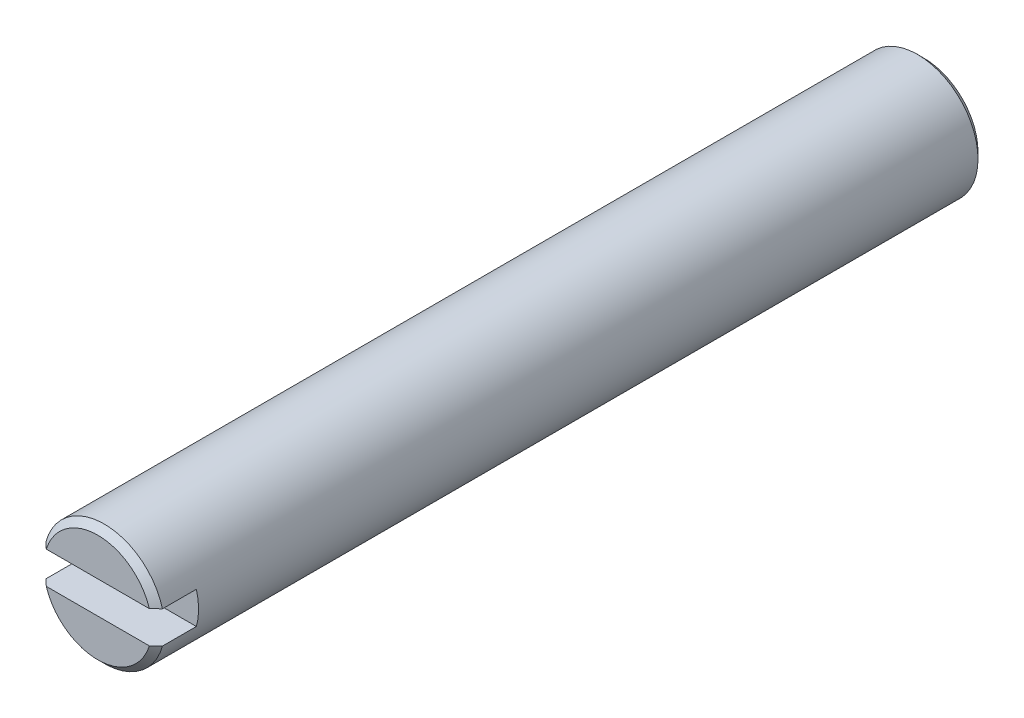
ISO-10303-21;
HEADER;
FILE_DESCRIPTION(('STEP AP214'),'2;1');
FILE_NAME('part.step','',(''),(''),'','','');
FILE_SCHEMA(('AUTOMOTIVE_DESIGN { 1 0 10303 214 1 1 1 1 }'));
ENDSEC;
DATA;
#1=APPLICATION_CONTEXT('core data for automotive mechanical design processes');
#2=APPLICATION_PROTOCOL_DEFINITION('international standard','automotive_design',2000,#1);
#3=PRODUCT_CONTEXT('',#1,'mechanical');
#4=PRODUCT('Part','Part','',(#3));
#5=PRODUCT_RELATED_PRODUCT_CATEGORY('part','',(#4));
#6=PRODUCT_DEFINITION_FORMATION('','',#4);
#7=PRODUCT_DEFINITION_CONTEXT('part definition',#1,'design');
#8=PRODUCT_DEFINITION('design','',#6,#7);
#9=PRODUCT_DEFINITION_SHAPE('','',#8);
#10=(LENGTH_UNIT() NAMED_UNIT(*) SI_UNIT(.MILLI.,.METRE.));
#11=(NAMED_UNIT(*) PLANE_ANGLE_UNIT() SI_UNIT($,.RADIAN.));
#12=(NAMED_UNIT(*) SI_UNIT($,.STERADIAN.) SOLID_ANGLE_UNIT());
#13=UNCERTAINTY_MEASURE_WITH_UNIT(LENGTH_MEASURE(1.E-05),#10,'distance_accuracy_value','');
#14=(GEOMETRIC_REPRESENTATION_CONTEXT(3) GLOBAL_UNCERTAINTY_ASSIGNED_CONTEXT((#13)) GLOBAL_UNIT_ASSIGNED_CONTEXT((#10,
#11,#12)) REPRESENTATION_CONTEXT('',''));
#15=CARTESIAN_POINT('',(0.,0.,0.));
#16=DIRECTION('',(0.,0.,1.));
#17=DIRECTION('',(1.,0.,0.));
#18=AXIS2_PLACEMENT_3D('',#15,#16,#17);
#19=CARTESIAN_POINT('',(0.,0.,2.563));
#20=DIRECTION('',(0.,0.,-1.));
#21=DIRECTION('',(-1.,0.,0.));
#22=AXIS2_PLACEMENT_3D('',#19,#20,#21);
#23=CYLINDRICAL_SURFACE('',#22,0.1875);
#24=CARTESIAN_POINT('',(0.,0.,0.0200000000000005));
#25=DIRECTION('',(0.,0.,1.));
#26=DIRECTION('',(1.,0.,0.));
#27=AXIS2_PLACEMENT_3D('',#24,#25,#26);
#28=CIRCLE('',#27,0.1875);
#29=CARTESIAN_POINT('',(0.1875,0.,0.0200000000000005));
#30=VERTEX_POINT('',#29);
#31=EDGE_CURVE('E52',#30,#30,#28,.T.);
#32=ORIENTED_EDGE('',*,*,#31,.T.);
#33=EDGE_LOOP('',(#32));
#34=FACE_BOUND('',#33,.T.);
#35=DIRECTION('',(0.,0.,1.));
#36=VECTOR('',#35,1.);
#37=CARTESIAN_POINT('',(0.180710403685012,-0.05,2.438));
#38=LINE('',#37,#36);
#39=CARTESIAN_POINT('',(0.180710403685012,-0.05,2.438));
#40=VERTEX_POINT('',#39);
#41=CARTESIAN_POINT('',(0.180710403685012,-0.05,2.543));
#42=VERTEX_POINT('',#41);
#43=EDGE_CURVE('E129',#40,#42,#38,.T.);
#44=ORIENTED_EDGE('',*,*,#43,.T.);
#45=CARTESIAN_POINT('',(0.,0.,2.543));
#46=DIRECTION('',(0.,0.,1.));
#47=DIRECTION('',(1.,0.,0.));
#48=AXIS2_PLACEMENT_3D('',#45,#46,#47);
#49=CIRCLE('',#48,0.1875);
#50=CARTESIAN_POINT('',(-0.180710403685012,-0.05,2.543));
#51=VERTEX_POINT('',#50);
#52=EDGE_CURVE('E59',#42,#51,#49,.F.);
#53=ORIENTED_EDGE('',*,*,#52,.T.);
#54=DIRECTION('',(0.,0.,1.));
#55=VECTOR('',#54,1.);
#56=CARTESIAN_POINT('',(-0.180710403685012,-0.05,2.438));
#57=LINE('',#56,#55);
#58=CARTESIAN_POINT('',(-0.180710403685012,-0.05,2.438));
#59=VERTEX_POINT('',#58);
#60=EDGE_CURVE('E108',#59,#51,#57,.T.);
#61=ORIENTED_EDGE('',*,*,#60,.F.);
#62=CARTESIAN_POINT('',(0.,0.,2.438));
#63=DIRECTION('',(0.,0.,1.));
#64=DIRECTION('',(1.,0.,0.));
#65=AXIS2_PLACEMENT_3D('',#62,#63,#64);
#66=CIRCLE('',#65,0.1875);
#67=CARTESIAN_POINT('',(-0.180710403685012,0.05,2.438));
#68=VERTEX_POINT('',#67);
#69=EDGE_CURVE('E115',#68,#59,#66,.T.);
#70=ORIENTED_EDGE('',*,*,#69,.F.);
#71=DIRECTION('',(0.,0.,1.));
#72=VECTOR('',#71,1.);
#73=CARTESIAN_POINT('',(-0.180710403685012,0.05,2.438));
#74=LINE('',#73,#72);
#75=CARTESIAN_POINT('',(-0.180710403685012,0.05,2.543));
#76=VERTEX_POINT('',#75);
#77=EDGE_CURVE('E97',#68,#76,#74,.T.);
#78=ORIENTED_EDGE('',*,*,#77,.T.);
#79=CARTESIAN_POINT('',(0.,0.,2.543));
#80=DIRECTION('',(0.,0.,1.));
#81=DIRECTION('',(1.,0.,0.));
#82=AXIS2_PLACEMENT_3D('',#79,#80,#81);
#83=CIRCLE('',#82,0.1875);
#84=CARTESIAN_POINT('',(0.180710403685012,0.05,2.543));
#85=VERTEX_POINT('',#84);
#86=EDGE_CURVE('E144',#76,#85,#83,.F.);
#87=ORIENTED_EDGE('',*,*,#86,.T.);
#88=DIRECTION('',(0.,0.,1.));
#89=VECTOR('',#88,1.);
#90=CARTESIAN_POINT('',(0.180710403685012,0.05,2.438));
#91=LINE('',#90,#89);
#92=CARTESIAN_POINT('',(0.180710403685012,0.05,2.438));
#93=VERTEX_POINT('',#92);
#94=EDGE_CURVE('E132',#93,#85,#91,.T.);
#95=ORIENTED_EDGE('',*,*,#94,.F.);
#96=EDGE_CURVE('E109',#40,#93,#66,.T.);
#97=ORIENTED_EDGE('',*,*,#96,.F.);
#98=EDGE_LOOP('',(#44,#53,#61,#70,#78,#87,#95,#97));
#99=FACE_BOUND('',#98,.T.);
#100=ADVANCED_FACE('F42',(#34,#99),#23,.T.);
#101=CARTESIAN_POINT('',(0.,0.,2.563));
#102=DIRECTION('',(0.,0.,1.));
#103=DIRECTION('',(1.,0.,0.));
#104=AXIS2_PLACEMENT_3D('',#101,#102,#103);
#105=PLANE('',#104);
#106=DIRECTION('',(1.,0.,0.));
#107=VECTOR('',#106,1.);
#108=CARTESIAN_POINT('',(0.,0.05,2.563));
#109=LINE('',#108,#107);
#110=CARTESIAN_POINT('',(-0.159863222787482,0.05,2.563));
#111=VERTEX_POINT('',#110);
#112=CARTESIAN_POINT('',(0.159863222787482,0.05,2.563));
#113=VERTEX_POINT('',#112);
#114=EDGE_CURVE('E227',#111,#113,#109,.T.);
#115=ORIENTED_EDGE('',*,*,#114,.T.);
#116=CARTESIAN_POINT('',(0.,0.,2.563));
#117=DIRECTION('',(0.,0.,1.));
#118=DIRECTION('',(1.,0.,0.));
#119=AXIS2_PLACEMENT_3D('',#116,#117,#118);
#120=CIRCLE('',#119,0.1675);
#121=EDGE_CURVE('E135',#113,#111,#120,.T.);
#122=ORIENTED_EDGE('',*,*,#121,.T.);
#123=EDGE_LOOP('',(#115,#122));
#124=FACE_BOUND('',#123,.T.);
#125=ADVANCED_FACE('F206',(#124),#105,.T.);
#126=DIRECTION('',(1.,0.,0.));
#127=VECTOR('',#126,1.);
#128=CARTESIAN_POINT('',(0.,-0.05,2.563));
#129=LINE('',#128,#127);
#130=CARTESIAN_POINT('',(-0.159863222787482,-0.05,2.563));
#131=VERTEX_POINT('',#130);
#132=CARTESIAN_POINT('',(0.159863222787482,-0.05,2.563));
#133=VERTEX_POINT('',#132);
#134=EDGE_CURVE('E119',#131,#133,#129,.T.);
#135=ORIENTED_EDGE('',*,*,#134,.F.);
#136=CARTESIAN_POINT('',(0.,0.,2.563));
#137=DIRECTION('',(0.,0.,1.));
#138=DIRECTION('',(1.,0.,0.));
#139=AXIS2_PLACEMENT_3D('',#136,#137,#138);
#140=CIRCLE('',#139,0.1675);
#141=EDGE_CURVE('E147',#131,#133,#140,.T.);
#142=ORIENTED_EDGE('',*,*,#141,.T.);
#143=EDGE_LOOP('',(#135,#142));
#144=FACE_BOUND('',#143,.T.);
#145=ADVANCED_FACE('F185',(#144),#105,.T.);
#146=CARTESIAN_POINT('',(0.,0.,0.));
#147=DIRECTION('',(0.,0.,1.));
#148=DIRECTION('',(1.,0.,0.));
#149=AXIS2_PLACEMENT_3D('',#146,#147,#148);
#150=PLANE('',#149);
#151=CARTESIAN_POINT('',(0.,0.,0.));
#152=DIRECTION('',(0.,0.,1.));
#153=DIRECTION('',(1.,0.,0.));
#154=AXIS2_PLACEMENT_3D('',#151,#152,#153);
#155=CIRCLE('',#154,0.1675);
#156=CARTESIAN_POINT('',(0.1675,0.,0.));
#157=VERTEX_POINT('',#156);
#158=EDGE_CURVE('E12',#157,#157,#155,.F.);
#159=ORIENTED_EDGE('',*,*,#158,.T.);
#160=EDGE_LOOP('',(#159));
#161=FACE_BOUND('',#160,.T.);
#162=ADVANCED_FACE('F184',(#161),#150,.F.);
#163=CARTESIAN_POINT('',(0.,0.05,2.438));
#164=DIRECTION('',(0.,-1.,0.));
#165=DIRECTION('',(0.,0.,-1.));
#166=AXIS2_PLACEMENT_3D('',#163,#164,#165);
#167=PLANE('',#166);
#168=ORIENTED_EDGE('',*,*,#114,.F.);
#169=CARTESIAN_POINT('',(-0.159863222787482,0.05,2.563));
#170=CARTESIAN_POINT('',(-0.163345869493428,0.05,2.55967512645176));
#171=CARTESIAN_POINT('',(-0.166824458065941,0.05,2.55634602287143));
#172=CARTESIAN_POINT('',(-0.173773518363763,0.05,2.54967935620335));
#173=CARTESIAN_POINT('',(-0.177243990090426,0.05,2.54634179311701));
#174=CARTESIAN_POINT('',(-0.180710403685012,0.05,2.543));
#175=B_SPLINE_CURVE_WITH_KNOTS('',3,(#169,#170,#171,#172,#173,#174),.UNSPECIFIED.,.F.,.F.,(4,2,
4),(0.,0.0144447769781474,0.0288895515436328),.UNSPECIFIED.);
#176=EDGE_CURVE('E104',#111,#76,#175,.T.);
#177=ORIENTED_EDGE('',*,*,#176,.T.);
#178=ORIENTED_EDGE('',*,*,#77,.F.);
#179=DIRECTION('',(1.,0.,0.));
#180=VECTOR('',#179,1.);
#181=CARTESIAN_POINT('',(0.,0.05,2.438));
#182=LINE('',#181,#180);
#183=EDGE_CURVE('E102',#68,#93,#182,.T.);
#184=ORIENTED_EDGE('',*,*,#183,.T.);
#185=ORIENTED_EDGE('',*,*,#94,.T.);
#186=CARTESIAN_POINT('',(0.180710403685012,0.05,2.543));
#187=CARTESIAN_POINT('',(0.177243990090426,0.05,2.54634179311701));
#188=CARTESIAN_POINT('',(0.173773518363762,0.05,2.54967935620335));
#189=CARTESIAN_POINT('',(0.166824458065941,0.05,2.55634602287143));
#190=CARTESIAN_POINT('',(0.163345869493428,0.05,2.55967512645176));
#191=CARTESIAN_POINT('',(0.159863222787482,0.05,2.563));
#192=B_SPLINE_CURVE_WITH_KNOTS('',3,(#186,#187,#188,#189,#190,#191),.UNSPECIFIED.,.F.,.F.,(4,2,
4),(0.,0.0144447745654854,0.0288895515436327),.UNSPECIFIED.);
#193=EDGE_CURVE('E139',#85,#113,#192,.T.);
#194=ORIENTED_EDGE('',*,*,#193,.T.);
#195=EDGE_LOOP('',(#168,#177,#178,#184,#185,#194));
#196=FACE_BOUND('',#195,.T.);
#197=ADVANCED_FACE('F100',(#196),#167,.T.);
#198=CARTESIAN_POINT('',(0.,-0.05,2.438));
#199=DIRECTION('',(0.,-1.,0.));
#200=DIRECTION('',(0.,0.,-1.));
#201=AXIS2_PLACEMENT_3D('',#198,#199,#200);
#202=PLANE('',#201);
#203=ORIENTED_EDGE('',*,*,#134,.T.);
#204=CARTESIAN_POINT('',(0.159863222787482,-0.05,2.563));
#205=CARTESIAN_POINT('',(0.163345869493428,-0.05,2.55967512645176));
#206=CARTESIAN_POINT('',(0.166824458065941,-0.05,2.55634602287143));
#207=CARTESIAN_POINT('',(0.173773518363763,-0.05,2.54967935620335));
#208=CARTESIAN_POINT('',(0.177243990090426,-0.05,2.54634179311701));
#209=CARTESIAN_POINT('',(0.180710403685012,-0.05,2.543));
#210=B_SPLINE_CURVE_WITH_KNOTS('',3,(#204,#205,#206,#207,#208,#209),.UNSPECIFIED.,.F.,.F.,(4,2,
4),(0.,0.0144447769781474,0.0288895515436328),.UNSPECIFIED.);
#211=EDGE_CURVE('E67',#133,#42,#210,.T.);
#212=ORIENTED_EDGE('',*,*,#211,.T.);
#213=ORIENTED_EDGE('',*,*,#43,.F.);
#214=DIRECTION('',(1.,0.,0.));
#215=VECTOR('',#214,1.);
#216=CARTESIAN_POINT('',(0.,-0.05,2.438));
#217=LINE('',#216,#215);
#218=EDGE_CURVE('E122',#59,#40,#217,.T.);
#219=ORIENTED_EDGE('',*,*,#218,.F.);
#220=ORIENTED_EDGE('',*,*,#60,.T.);
#221=CARTESIAN_POINT('',(-0.180710403685012,-0.05,2.543));
#222=CARTESIAN_POINT('',(-0.177243990090426,-0.05,2.54634179311701));
#223=CARTESIAN_POINT('',(-0.173773518363762,-0.05,2.54967935620335));
#224=CARTESIAN_POINT('',(-0.166824458065941,-0.05,2.55634602287143));
#225=CARTESIAN_POINT('',(-0.163345869493428,-0.05,2.55967512645176));
#226=CARTESIAN_POINT('',(-0.159863222787482,-0.05,2.563));
#227=B_SPLINE_CURVE_WITH_KNOTS('',3,(#221,#222,#223,#224,#225,#226),.UNSPECIFIED.,.F.,.F.,(4,2,
4),(0.,0.0144447745654854,0.0288895515436327),.UNSPECIFIED.);
#228=EDGE_CURVE('E151',#51,#131,#227,.T.);
#229=ORIENTED_EDGE('',*,*,#228,.T.);
#230=EDGE_LOOP('',(#203,#212,#213,#219,#220,#229));
#231=FACE_BOUND('',#230,.T.);
#232=ADVANCED_FACE('F175',(#231),#202,.F.);
#233=CARTESIAN_POINT('',(0.,0.,2.438));
#234=DIRECTION('',(0.,0.,1.));
#235=DIRECTION('',(1.,0.,0.));
#236=AXIS2_PLACEMENT_3D('',#233,#234,#235);
#237=PLANE('',#236);
#238=ORIENTED_EDGE('',*,*,#183,.F.);
#239=ORIENTED_EDGE('',*,*,#69,.T.);
#240=ORIENTED_EDGE('',*,*,#218,.T.);
#241=ORIENTED_EDGE('',*,*,#96,.T.);
#242=EDGE_LOOP('',(#238,#239,#240,#241));
#243=FACE_BOUND('',#242,.T.);
#244=ADVANCED_FACE('F113',(#243),#237,.T.);
#245=CARTESIAN_POINT('',(0.,0.,2.563));
#246=DIRECTION('',(0.,0.,-1.));
#247=DIRECTION('',(-1.,0.,0.));
#248=AXIS2_PLACEMENT_3D('',#245,#246,#247);
#249=CONICAL_SURFACE('',#248,0.1675,0.78539816339745);
#250=ORIENTED_EDGE('',*,*,#193,.F.);
#251=ORIENTED_EDGE('',*,*,#86,.F.);
#252=ORIENTED_EDGE('',*,*,#176,.F.);
#253=ORIENTED_EDGE('',*,*,#121,.F.);
#254=EDGE_LOOP('',(#250,#251,#252,#253));
#255=FACE_BOUND('',#254,.T.);
#256=ADVANCED_FACE('F197',(#255),#249,.T.);
#257=CARTESIAN_POINT('',(0.,0.,2.563));
#258=DIRECTION('',(0.,0.,-1.));
#259=DIRECTION('',(-1.,0.,0.));
#260=AXIS2_PLACEMENT_3D('',#257,#258,#259);
#261=CONICAL_SURFACE('',#260,0.1675,0.78539816339745);
#262=ORIENTED_EDGE('',*,*,#228,.F.);
#263=ORIENTED_EDGE('',*,*,#52,.F.);
#264=ORIENTED_EDGE('',*,*,#211,.F.);
#265=ORIENTED_EDGE('',*,*,#141,.F.);
#266=EDGE_LOOP('',(#262,#263,#264,#265));
#267=FACE_BOUND('',#266,.T.);
#268=ADVANCED_FACE('F172',(#267),#261,.T.);
#269=CARTESIAN_POINT('',(0.,0.,0.0200000000000005));
#270=DIRECTION('',(0.,0.,1.));
#271=DIRECTION('',(1.,0.,0.));
#272=AXIS2_PLACEMENT_3D('',#269,#270,#271);
#273=CONICAL_SURFACE('',#272,0.1875,0.785398163397444);
#274=ORIENTED_EDGE('',*,*,#158,.F.);
#275=EDGE_LOOP('',(#274));
#276=FACE_BOUND('',#275,.T.);
#277=ORIENTED_EDGE('',*,*,#31,.F.);
#278=EDGE_LOOP('',(#277));
#279=FACE_BOUND('',#278,.T.);
#280=ADVANCED_FACE('F45',(#276,#279),#273,.T.);
#281=CLOSED_SHELL('',(#100,#125,#145,#162,#197,#232,#244,#256,#268,#280));
#282=MANIFOLD_SOLID_BREP('B2',#281);
#283=ADVANCED_BREP_SHAPE_REPRESENTATION('',(#18,#282),#14);
#284=SHAPE_DEFINITION_REPRESENTATION(#9,#283);
ENDSEC;
END-ISO-10303-21;
